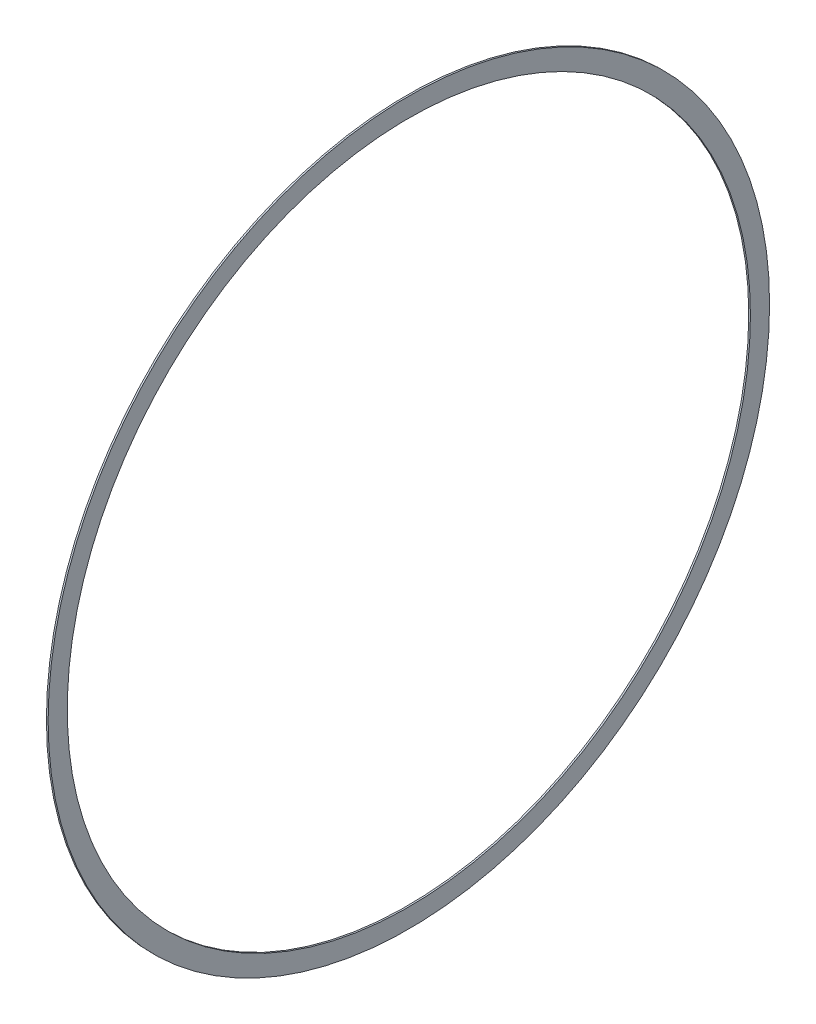
ISO-10303-21;
HEADER;
FILE_DESCRIPTION(('STEP AP214'),'2;1');
FILE_NAME('part.step','',(''),(''),'','','');
FILE_SCHEMA(('AUTOMOTIVE_DESIGN { 1 0 10303 214 1 1 1 1 }'));
ENDSEC;
DATA;
#1=APPLICATION_CONTEXT('core data for automotive mechanical design processes');
#2=APPLICATION_PROTOCOL_DEFINITION('international standard','automotive_design',2000,#1);
#3=PRODUCT_CONTEXT('',#1,'mechanical');
#4=PRODUCT('Part','Part','',(#3));
#5=PRODUCT_RELATED_PRODUCT_CATEGORY('part','',(#4));
#6=PRODUCT_DEFINITION_FORMATION('','',#4);
#7=PRODUCT_DEFINITION_CONTEXT('part definition',#1,'design');
#8=PRODUCT_DEFINITION('design','',#6,#7);
#9=PRODUCT_DEFINITION_SHAPE('','',#8);
#10=(LENGTH_UNIT() NAMED_UNIT(*) SI_UNIT(.MILLI.,.METRE.));
#11=(NAMED_UNIT(*) PLANE_ANGLE_UNIT() SI_UNIT($,.RADIAN.));
#12=(NAMED_UNIT(*) SI_UNIT($,.STERADIAN.) SOLID_ANGLE_UNIT());
#13=UNCERTAINTY_MEASURE_WITH_UNIT(LENGTH_MEASURE(1.E-05),#10,'distance_accuracy_value','');
#14=(GEOMETRIC_REPRESENTATION_CONTEXT(3) GLOBAL_UNCERTAINTY_ASSIGNED_CONTEXT((#13)) GLOBAL_UNIT_ASSIGNED_CONTEXT((#10,
#11,#12)) REPRESENTATION_CONTEXT('',''));
#15=CARTESIAN_POINT('',(0.,0.,0.));
#16=DIRECTION('',(0.,0.,1.));
#17=DIRECTION('',(1.,0.,0.));
#18=AXIS2_PLACEMENT_3D('',#15,#16,#17);
#19=CARTESIAN_POINT('',(4.,0.,0.));
#20=DIRECTION('',(1.,0.,0.));
#21=DIRECTION('',(0.,0.,-1.));
#22=AXIS2_PLACEMENT_3D('',#19,#20,#21);
#23=PLANE('',#22);
#24=CARTESIAN_POINT('',(4.,0.,0.));
#25=DIRECTION('',(1.,0.,0.));
#26=DIRECTION('',(0.,0.,-1.));
#27=AXIS2_PLACEMENT_3D('',#24,#25,#26);
#28=CIRCLE('',#27,848.);
#29=CARTESIAN_POINT('',(4.,0.,-848.));
#30=VERTEX_POINT('',#29);
#31=EDGE_CURVE('E10',#30,#30,#28,.T.);
#32=ORIENTED_EDGE('',*,*,#31,.T.);
#33=EDGE_LOOP('',(#32));
#34=FACE_BOUND('',#33,.T.);
#35=CARTESIAN_POINT('',(4.,0.,0.));
#36=DIRECTION('',(1.,0.,0.));
#37=DIRECTION('',(0.,0.,-1.));
#38=AXIS2_PLACEMENT_3D('',#35,#36,#37);
#39=CIRCLE('',#38,803.);
#40=CARTESIAN_POINT('',(4.,0.,-803.));
#41=VERTEX_POINT('',#40);
#42=EDGE_CURVE('E42',#41,#41,#39,.T.);
#43=ORIENTED_EDGE('',*,*,#42,.F.);
#44=EDGE_LOOP('',(#43));
#45=FACE_BOUND('',#44,.T.);
#46=ADVANCED_FACE('F31',(#34,#45),#23,.T.);
#47=CARTESIAN_POINT('',(0.,0.,0.));
#48=DIRECTION('',(1.,0.,0.));
#49=DIRECTION('',(0.,0.,-1.));
#50=AXIS2_PLACEMENT_3D('',#47,#48,#49);
#51=PLANE('',#50);
#52=CARTESIAN_POINT('',(0.,0.,0.));
#53=DIRECTION('',(1.,0.,0.));
#54=DIRECTION('',(0.,0.,-1.));
#55=AXIS2_PLACEMENT_3D('',#52,#53,#54);
#56=CIRCLE('',#55,848.);
#57=CARTESIAN_POINT('',(0.,0.,-848.));
#58=VERTEX_POINT('',#57);
#59=EDGE_CURVE('E35',#58,#58,#56,.T.);
#60=ORIENTED_EDGE('',*,*,#59,.F.);
#61=EDGE_LOOP('',(#60));
#62=FACE_BOUND('',#61,.T.);
#63=CARTESIAN_POINT('',(0.,0.,0.));
#64=DIRECTION('',(1.,0.,0.));
#65=DIRECTION('',(0.,0.,-1.));
#66=AXIS2_PLACEMENT_3D('',#63,#64,#65);
#67=CIRCLE('',#66,803.);
#68=CARTESIAN_POINT('',(0.,0.,-803.));
#69=VERTEX_POINT('',#68);
#70=EDGE_CURVE('E44',#69,#69,#67,.T.);
#71=ORIENTED_EDGE('',*,*,#70,.T.);
#72=EDGE_LOOP('',(#71));
#73=FACE_BOUND('',#72,.T.);
#74=ADVANCED_FACE('F54',(#62,#73),#51,.F.);
#75=CARTESIAN_POINT('',(4.,0.,0.));
#76=DIRECTION('',(-1.,0.,0.));
#77=DIRECTION('',(0.,0.,1.));
#78=AXIS2_PLACEMENT_3D('',#75,#76,#77);
#79=CYLINDRICAL_SURFACE('',#78,848.);
#80=ORIENTED_EDGE('',*,*,#31,.F.);
#81=EDGE_LOOP('',(#80));
#82=FACE_BOUND('',#81,.T.);
#83=ORIENTED_EDGE('',*,*,#59,.T.);
#84=EDGE_LOOP('',(#83));
#85=FACE_BOUND('',#84,.T.);
#86=ADVANCED_FACE('F33',(#82,#85),#79,.T.);
#87=CARTESIAN_POINT('',(4.,0.,0.));
#88=DIRECTION('',(-1.,0.,0.));
#89=DIRECTION('',(0.,0.,1.));
#90=AXIS2_PLACEMENT_3D('',#87,#88,#89);
#91=CYLINDRICAL_SURFACE('',#90,803.);
#92=ORIENTED_EDGE('',*,*,#42,.T.);
#93=EDGE_LOOP('',(#92));
#94=FACE_BOUND('',#93,.T.);
#95=ORIENTED_EDGE('',*,*,#70,.F.);
#96=EDGE_LOOP('',(#95));
#97=FACE_BOUND('',#96,.T.);
#98=ADVANCED_FACE('F50',(#94,#97),#91,.F.);
#99=CLOSED_SHELL('',(#46,#74,#86,#98));
#100=MANIFOLD_SOLID_BREP('B2',#99);
#101=ADVANCED_BREP_SHAPE_REPRESENTATION('',(#18,#100),#14);
#102=SHAPE_DEFINITION_REPRESENTATION(#9,#101);
ENDSEC;
END-ISO-10303-21;
